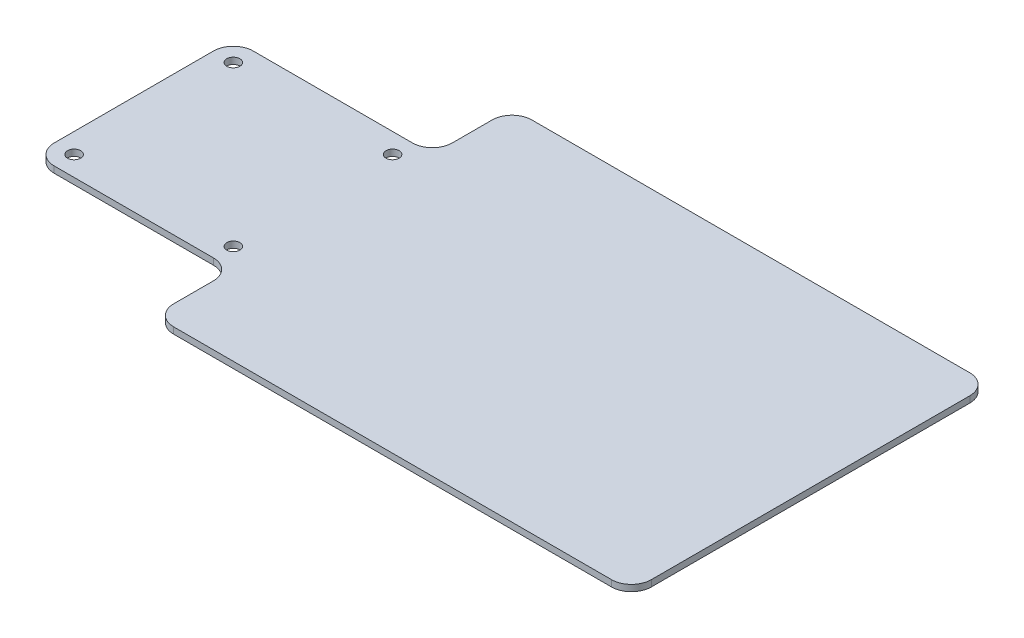
ISO-10303-21;
HEADER;
FILE_DESCRIPTION(('STEP AP214'),'2;1');
FILE_NAME('part.step','',(''),(''),'','','');
FILE_SCHEMA(('AUTOMOTIVE_DESIGN { 1 0 10303 214 1 1 1 1 }'));
ENDSEC;
DATA;
#1=APPLICATION_CONTEXT('core data for automotive mechanical design processes');
#2=APPLICATION_PROTOCOL_DEFINITION('international standard','automotive_design',2000,#1);
#3=PRODUCT_CONTEXT('',#1,'mechanical');
#4=PRODUCT('Part','Part','',(#3));
#5=PRODUCT_RELATED_PRODUCT_CATEGORY('part','',(#4));
#6=PRODUCT_DEFINITION_FORMATION('','',#4);
#7=PRODUCT_DEFINITION_CONTEXT('part definition',#1,'design');
#8=PRODUCT_DEFINITION('design','',#6,#7);
#9=PRODUCT_DEFINITION_SHAPE('','',#8);
#10=(LENGTH_UNIT() NAMED_UNIT(*) SI_UNIT(.MILLI.,.METRE.));
#11=(NAMED_UNIT(*) PLANE_ANGLE_UNIT() SI_UNIT($,.RADIAN.));
#12=(NAMED_UNIT(*) SI_UNIT($,.STERADIAN.) SOLID_ANGLE_UNIT());
#13=UNCERTAINTY_MEASURE_WITH_UNIT(LENGTH_MEASURE(1.E-05),#10,'distance_accuracy_value','');
#14=(GEOMETRIC_REPRESENTATION_CONTEXT(3) GLOBAL_UNCERTAINTY_ASSIGNED_CONTEXT((#13)) GLOBAL_UNIT_ASSIGNED_CONTEXT((#10,
#11,#12)) REPRESENTATION_CONTEXT('',''));
#15=CARTESIAN_POINT('',(0.,0.,0.));
#16=DIRECTION('',(0.,0.,1.));
#17=DIRECTION('',(1.,0.,0.));
#18=AXIS2_PLACEMENT_3D('',#15,#16,#17);
#19=CARTESIAN_POINT('',(-25.,1.6,25.));
#20=DIRECTION('',(0.,0.,-1.));
#21=DIRECTION('',(-1.,0.,0.));
#22=AXIS2_PLACEMENT_3D('',#19,#20,#21);
#23=PLANE('',#22);
#24=DIRECTION('',(1.,0.,0.));
#25=VECTOR('',#24,1.);
#26=CARTESIAN_POINT('',(-25.,1.6,25.));
#27=LINE('',#26,#25);
#28=CARTESIAN_POINT('',(-20.,1.6,25.));
#29=VERTEX_POINT('',#28);
#30=CARTESIAN_POINT('',(20.,1.6,25.));
#31=VERTEX_POINT('',#30);
#32=EDGE_CURVE('E164',#29,#31,#27,.T.);
#33=ORIENTED_EDGE('',*,*,#32,.F.);
#34=DIRECTION('',(0.,-1.,0.));
#35=VECTOR('',#34,1.);
#36=CARTESIAN_POINT('',(-20.,1.6,25.));
#37=LINE('',#36,#35);
#38=CARTESIAN_POINT('',(-20.,0.,25.));
#39=VERTEX_POINT('',#38);
#40=EDGE_CURVE('E149',#29,#39,#37,.T.);
#41=ORIENTED_EDGE('',*,*,#40,.T.);
#42=DIRECTION('',(1.,0.,0.));
#43=VECTOR('',#42,1.);
#44=CARTESIAN_POINT('',(-25.,0.,25.));
#45=LINE('',#44,#43);
#46=CARTESIAN_POINT('',(20.,0.,25.));
#47=VERTEX_POINT('',#46);
#48=EDGE_CURVE('E161',#39,#47,#45,.T.);
#49=ORIENTED_EDGE('',*,*,#48,.T.);
#50=DIRECTION('',(0.,-1.,0.));
#51=VECTOR('',#50,1.);
#52=CARTESIAN_POINT('',(20.,1.6,25.));
#53=LINE('',#52,#51);
#54=EDGE_CURVE('E166',#47,#31,#53,.F.);
#55=ORIENTED_EDGE('',*,*,#54,.T.);
#56=EDGE_LOOP('',(#33,#41,#49,#55));
#57=FACE_BOUND('',#56,.T.);
#58=ADVANCED_FACE('F32',(#57),#23,.F.);
#59=CARTESIAN_POINT('',(25.,1.6,25.));
#60=DIRECTION('',(1.,0.,0.));
#61=DIRECTION('',(0.,0.,-1.));
#62=AXIS2_PLACEMENT_3D('',#59,#60,#61);
#63=PLANE('',#62);
#64=DIRECTION('',(0.,0.,1.));
#65=VECTOR('',#64,1.);
#66=CARTESIAN_POINT('',(25.,1.6,25.));
#67=LINE('',#66,#65);
#68=CARTESIAN_POINT('',(25.,1.6,30.));
#69=VERTEX_POINT('',#68);
#70=CARTESIAN_POINT('',(25.,1.6,40.));
#71=VERTEX_POINT('',#70);
#72=EDGE_CURVE('E280',#69,#71,#67,.T.);
#73=ORIENTED_EDGE('',*,*,#72,.F.);
#74=DIRECTION('',(0.,-1.,0.));
#75=VECTOR('',#74,1.);
#76=CARTESIAN_POINT('',(25.,0.,30.));
#77=LINE('',#76,#75);
#78=CARTESIAN_POINT('',(25.,0.,30.));
#79=VERTEX_POINT('',#78);
#80=EDGE_CURVE('E225',#69,#79,#77,.T.);
#81=ORIENTED_EDGE('',*,*,#80,.T.);
#82=DIRECTION('',(0.,0.,1.));
#83=VECTOR('',#82,1.);
#84=CARTESIAN_POINT('',(25.,0.,25.));
#85=LINE('',#84,#83);
#86=CARTESIAN_POINT('',(25.,0.,40.));
#87=VERTEX_POINT('',#86);
#88=EDGE_CURVE('E171',#79,#87,#85,.T.);
#89=ORIENTED_EDGE('',*,*,#88,.T.);
#90=DIRECTION('',(0.,-1.,0.));
#91=VECTOR('',#90,1.);
#92=CARTESIAN_POINT('',(25.,1.6,40.));
#93=LINE('',#92,#91);
#94=EDGE_CURVE('E223',#87,#71,#93,.F.);
#95=ORIENTED_EDGE('',*,*,#94,.T.);
#96=EDGE_LOOP('',(#73,#81,#89,#95));
#97=FACE_BOUND('',#96,.T.);
#98=ADVANCED_FACE('F338',(#97),#63,.F.);
#99=CARTESIAN_POINT('',(25.,1.6,45.));
#100=DIRECTION('',(0.,0.,-1.));
#101=DIRECTION('',(-1.,0.,0.));
#102=AXIS2_PLACEMENT_3D('',#99,#100,#101);
#103=PLANE('',#102);
#104=DIRECTION('',(1.,0.,0.));
#105=VECTOR('',#104,1.);
#106=CARTESIAN_POINT('',(25.,1.6,45.));
#107=LINE('',#106,#105);
#108=CARTESIAN_POINT('',(30.,1.6,45.));
#109=VERTEX_POINT('',#108);
#110=CARTESIAN_POINT('',(140.,1.6,45.));
#111=VERTEX_POINT('',#110);
#112=EDGE_CURVE('E277',#109,#111,#107,.T.);
#113=ORIENTED_EDGE('',*,*,#112,.F.);
#114=DIRECTION('',(0.,-1.,0.));
#115=VECTOR('',#114,1.);
#116=CARTESIAN_POINT('',(30.,1.6,45.));
#117=LINE('',#116,#115);
#118=CARTESIAN_POINT('',(30.,0.,45.));
#119=VERTEX_POINT('',#118);
#120=EDGE_CURVE('E230',#109,#119,#117,.T.);
#121=ORIENTED_EDGE('',*,*,#120,.T.);
#122=DIRECTION('',(1.,0.,0.));
#123=VECTOR('',#122,1.);
#124=CARTESIAN_POINT('',(25.,0.,45.));
#125=LINE('',#124,#123);
#126=CARTESIAN_POINT('',(140.,0.,45.));
#127=VERTEX_POINT('',#126);
#128=EDGE_CURVE('E175',#119,#127,#125,.T.);
#129=ORIENTED_EDGE('',*,*,#128,.T.);
#130=DIRECTION('',(0.,-1.,0.));
#131=VECTOR('',#130,1.);
#132=CARTESIAN_POINT('',(140.,1.6,45.));
#133=LINE('',#132,#131);
#134=EDGE_CURVE('E228',#127,#111,#133,.F.);
#135=ORIENTED_EDGE('',*,*,#134,.T.);
#136=EDGE_LOOP('',(#113,#121,#129,#135));
#137=FACE_BOUND('',#136,.T.);
#138=ADVANCED_FACE('F343',(#137),#103,.F.);
#139=CARTESIAN_POINT('',(145.,1.6,-45.));
#140=DIRECTION('',(-1.,0.,0.));
#141=DIRECTION('',(0.,0.,1.));
#142=AXIS2_PLACEMENT_3D('',#139,#140,#141);
#143=PLANE('',#142);
#144=DIRECTION('',(0.,0.,-1.));
#145=VECTOR('',#144,1.);
#146=CARTESIAN_POINT('',(145.,0.,-45.));
#147=LINE('',#146,#145);
#148=CARTESIAN_POINT('',(145.,0.,40.));
#149=VERTEX_POINT('',#148);
#150=CARTESIAN_POINT('',(145.,0.,-40.));
#151=VERTEX_POINT('',#150);
#152=EDGE_CURVE('E186',#149,#151,#147,.T.);
#153=ORIENTED_EDGE('',*,*,#152,.T.);
#154=DIRECTION('',(0.,-1.,0.));
#155=VECTOR('',#154,1.);
#156=CARTESIAN_POINT('',(145.,1.6,-40.));
#157=LINE('',#156,#155);
#158=CARTESIAN_POINT('',(145.,1.6,-40.));
#159=VERTEX_POINT('',#158);
#160=EDGE_CURVE('E250',#151,#159,#157,.F.);
#161=ORIENTED_EDGE('',*,*,#160,.T.);
#162=DIRECTION('',(0.,0.,-1.));
#163=VECTOR('',#162,1.);
#164=CARTESIAN_POINT('',(145.,1.6,-45.));
#165=LINE('',#164,#163);
#166=CARTESIAN_POINT('',(145.,1.6,40.));
#167=VERTEX_POINT('',#166);
#168=EDGE_CURVE('E274',#167,#159,#165,.T.);
#169=ORIENTED_EDGE('',*,*,#168,.F.);
#170=DIRECTION('',(0.,-1.,0.));
#171=VECTOR('',#170,1.);
#172=CARTESIAN_POINT('',(145.,1.6,40.));
#173=LINE('',#172,#171);
#174=EDGE_CURVE('E247',#167,#149,#173,.T.);
#175=ORIENTED_EDGE('',*,*,#174,.T.);
#176=EDGE_LOOP('',(#153,#161,#169,#175));
#177=FACE_BOUND('',#176,.T.);
#178=ADVANCED_FACE('F373',(#177),#143,.F.);
#179=CARTESIAN_POINT('',(25.,1.6,-45.));
#180=DIRECTION('',(0.,0.,1.));
#181=DIRECTION('',(1.,0.,0.));
#182=AXIS2_PLACEMENT_3D('',#179,#180,#181);
#183=PLANE('',#182);
#184=DIRECTION('',(-1.,0.,0.));
#185=VECTOR('',#184,1.);
#186=CARTESIAN_POINT('',(25.,0.,-45.));
#187=LINE('',#186,#185);
#188=CARTESIAN_POINT('',(140.,0.,-45.));
#189=VERTEX_POINT('',#188);
#190=CARTESIAN_POINT('',(30.,0.,-45.));
#191=VERTEX_POINT('',#190);
#192=EDGE_CURVE('E189',#189,#191,#187,.T.);
#193=ORIENTED_EDGE('',*,*,#192,.T.);
#194=DIRECTION('',(0.,-1.,0.));
#195=VECTOR('',#194,1.);
#196=CARTESIAN_POINT('',(30.,1.6,-45.));
#197=LINE('',#196,#195);
#198=CARTESIAN_POINT('',(30.,1.6,-45.));
#199=VERTEX_POINT('',#198);
#200=EDGE_CURVE('E241',#191,#199,#197,.F.);
#201=ORIENTED_EDGE('',*,*,#200,.T.);
#202=DIRECTION('',(-1.,0.,0.));
#203=VECTOR('',#202,1.);
#204=CARTESIAN_POINT('',(25.,1.6,-45.));
#205=LINE('',#204,#203);
#206=CARTESIAN_POINT('',(140.,1.6,-45.));
#207=VERTEX_POINT('',#206);
#208=EDGE_CURVE('E269',#207,#199,#205,.T.);
#209=ORIENTED_EDGE('',*,*,#208,.F.);
#210=DIRECTION('',(0.,-1.,0.));
#211=VECTOR('',#210,1.);
#212=CARTESIAN_POINT('',(140.,1.6,-45.));
#213=LINE('',#212,#211);
#214=EDGE_CURVE('E238',#207,#189,#213,.T.);
#215=ORIENTED_EDGE('',*,*,#214,.T.);
#216=EDGE_LOOP('',(#193,#201,#209,#215));
#217=FACE_BOUND('',#216,.T.);
#218=ADVANCED_FACE('F368',(#217),#183,.F.);
#219=CARTESIAN_POINT('',(25.,1.6,-25.));
#220=DIRECTION('',(1.,0.,0.));
#221=DIRECTION('',(0.,0.,-1.));
#222=AXIS2_PLACEMENT_3D('',#219,#220,#221);
#223=PLANE('',#222);
#224=DIRECTION('',(0.,0.,1.));
#225=VECTOR('',#224,1.);
#226=CARTESIAN_POINT('',(25.,1.6,-25.));
#227=LINE('',#226,#225);
#228=CARTESIAN_POINT('',(25.,1.6,-40.));
#229=VERTEX_POINT('',#228);
#230=CARTESIAN_POINT('',(25.,1.6,-30.));
#231=VERTEX_POINT('',#230);
#232=EDGE_CURVE('E267',#229,#231,#227,.T.);
#233=ORIENTED_EDGE('',*,*,#232,.F.);
#234=DIRECTION('',(0.,-1.,0.));
#235=VECTOR('',#234,1.);
#236=CARTESIAN_POINT('',(25.,1.6,-40.));
#237=LINE('',#236,#235);
#238=CARTESIAN_POINT('',(25.,0.,-40.));
#239=VERTEX_POINT('',#238);
#240=EDGE_CURVE('E235',#229,#239,#237,.T.);
#241=ORIENTED_EDGE('',*,*,#240,.T.);
#242=DIRECTION('',(0.,0.,1.));
#243=VECTOR('',#242,1.);
#244=CARTESIAN_POINT('',(25.,0.,-25.));
#245=LINE('',#244,#243);
#246=CARTESIAN_POINT('',(25.,0.,-30.));
#247=VERTEX_POINT('',#246);
#248=EDGE_CURVE('E192',#239,#247,#245,.T.);
#249=ORIENTED_EDGE('',*,*,#248,.T.);
#250=DIRECTION('',(0.,-1.,0.));
#251=VECTOR('',#250,1.);
#252=CARTESIAN_POINT('',(25.,1.6,-30.));
#253=LINE('',#252,#251);
#254=EDGE_CURVE('E233',#247,#231,#253,.F.);
#255=ORIENTED_EDGE('',*,*,#254,.T.);
#256=EDGE_LOOP('',(#233,#241,#249,#255));
#257=FACE_BOUND('',#256,.T.);
#258=ADVANCED_FACE('F261',(#257),#223,.F.);
#259=CARTESIAN_POINT('',(-25.,1.6,-25.));
#260=DIRECTION('',(0.,0.,1.));
#261=DIRECTION('',(1.,0.,0.));
#262=AXIS2_PLACEMENT_3D('',#259,#260,#261);
#263=PLANE('',#262);
#264=DIRECTION('',(-1.,0.,0.));
#265=VECTOR('',#264,1.);
#266=CARTESIAN_POINT('',(-25.,1.6,-25.));
#267=LINE('',#266,#265);
#268=CARTESIAN_POINT('',(20.,1.6,-25.));
#269=VERTEX_POINT('',#268);
#270=CARTESIAN_POINT('',(-20.,1.6,-25.));
#271=VERTEX_POINT('',#270);
#272=EDGE_CURVE('E265',#269,#271,#267,.T.);
#273=ORIENTED_EDGE('',*,*,#272,.F.);
#274=DIRECTION('',(0.,-1.,0.));
#275=VECTOR('',#274,1.);
#276=CARTESIAN_POINT('',(20.,0.,-25.));
#277=LINE('',#276,#275);
#278=CARTESIAN_POINT('',(20.,0.,-25.));
#279=VERTEX_POINT('',#278);
#280=EDGE_CURVE('E244',#269,#279,#277,.T.);
#281=ORIENTED_EDGE('',*,*,#280,.T.);
#282=DIRECTION('',(-1.,0.,0.));
#283=VECTOR('',#282,1.);
#284=CARTESIAN_POINT('',(-25.,0.,-25.));
#285=LINE('',#284,#283);
#286=CARTESIAN_POINT('',(-20.,0.,-25.));
#287=VERTEX_POINT('',#286);
#288=EDGE_CURVE('E195',#279,#287,#285,.T.);
#289=ORIENTED_EDGE('',*,*,#288,.T.);
#290=DIRECTION('',(0.,-1.,0.));
#291=VECTOR('',#290,1.);
#292=CARTESIAN_POINT('',(-20.,1.6,-25.));
#293=LINE('',#292,#291);
#294=EDGE_CURVE('E47',#287,#271,#293,.F.);
#295=ORIENTED_EDGE('',*,*,#294,.T.);
#296=EDGE_LOOP('',(#273,#281,#289,#295));
#297=FACE_BOUND('',#296,.T.);
#298=ADVANCED_FACE('F264',(#297),#263,.F.);
#299=CARTESIAN_POINT('',(-25.,1.6,-25.));
#300=DIRECTION('',(1.,0.,0.));
#301=DIRECTION('',(0.,0.,-1.));
#302=AXIS2_PLACEMENT_3D('',#299,#300,#301);
#303=PLANE('',#302);
#304=DIRECTION('',(0.,0.,1.));
#305=VECTOR('',#304,1.);
#306=CARTESIAN_POINT('',(-25.,0.,-25.));
#307=LINE('',#306,#305);
#308=CARTESIAN_POINT('',(-25.,0.,-20.));
#309=VERTEX_POINT('',#308);
#310=CARTESIAN_POINT('',(-25.,0.,20.));
#311=VERTEX_POINT('',#310);
#312=EDGE_CURVE('E197',#309,#311,#307,.T.);
#313=ORIENTED_EDGE('',*,*,#312,.T.);
#314=DIRECTION('',(0.,-1.,0.));
#315=VECTOR('',#314,1.);
#316=CARTESIAN_POINT('',(-25.,1.6,20.));
#317=LINE('',#316,#315);
#318=CARTESIAN_POINT('',(-25.,1.6,20.));
#319=VERTEX_POINT('',#318);
#320=EDGE_CURVE('E150',#311,#319,#317,.F.);
#321=ORIENTED_EDGE('',*,*,#320,.T.);
#322=DIRECTION('',(0.,0.,1.));
#323=VECTOR('',#322,1.);
#324=CARTESIAN_POINT('',(-25.,1.6,-25.));
#325=LINE('',#324,#323);
#326=CARTESIAN_POINT('',(-25.,1.6,-20.));
#327=VERTEX_POINT('',#326);
#328=EDGE_CURVE('E181',#327,#319,#325,.T.);
#329=ORIENTED_EDGE('',*,*,#328,.F.);
#330=DIRECTION('',(0.,-1.,0.));
#331=VECTOR('',#330,1.);
#332=CARTESIAN_POINT('',(-25.,1.6,-20.));
#333=LINE('',#332,#331);
#334=EDGE_CURVE('E155',#327,#309,#333,.T.);
#335=ORIENTED_EDGE('',*,*,#334,.T.);
#336=EDGE_LOOP('',(#313,#321,#329,#335));
#337=FACE_BOUND('',#336,.T.);
#338=ADVANCED_FACE('F318',(#337),#303,.F.);
#339=CARTESIAN_POINT('',(0.,1.6,0.));
#340=DIRECTION('',(0.,-1.,0.));
#341=DIRECTION('',(0.,0.,-1.));
#342=AXIS2_PLACEMENT_3D('',#339,#340,#341);
#343=PLANE('',#342);
#344=CARTESIAN_POINT('',(-20.,1.6,20.));
#345=DIRECTION('',(0.,1.,0.));
#346=DIRECTION('',(0.,0.,1.));
#347=AXIS2_PLACEMENT_3D('',#344,#345,#346);
#348=CIRCLE('',#347,1.65);
#349=CARTESIAN_POINT('',(-20.,1.6,21.65));
#350=VERTEX_POINT('',#349);
#351=EDGE_CURVE('E287',#350,#350,#348,.T.);
#352=ORIENTED_EDGE('',*,*,#351,.F.);
#353=EDGE_LOOP('',(#352));
#354=FACE_BOUND('',#353,.T.);
#355=CARTESIAN_POINT('',(20.,1.6,20.));
#356=DIRECTION('',(0.,1.,0.));
#357=DIRECTION('',(0.,0.,1.));
#358=AXIS2_PLACEMENT_3D('',#355,#356,#357);
#359=CIRCLE('',#358,1.65);
#360=CARTESIAN_POINT('',(20.,1.6,21.65));
#361=VERTEX_POINT('',#360);
#362=EDGE_CURVE('E293',#361,#361,#359,.T.);
#363=ORIENTED_EDGE('',*,*,#362,.F.);
#364=EDGE_LOOP('',(#363));
#365=FACE_BOUND('',#364,.T.);
#366=CARTESIAN_POINT('',(20.,1.6,-20.));
#367=DIRECTION('',(0.,1.,0.));
#368=DIRECTION('',(0.,0.,1.));
#369=AXIS2_PLACEMENT_3D('',#366,#367,#368);
#370=CIRCLE('',#369,1.65);
#371=CARTESIAN_POINT('',(20.,1.6,-18.35));
#372=VERTEX_POINT('',#371);
#373=EDGE_CURVE('E299',#372,#372,#370,.T.);
#374=ORIENTED_EDGE('',*,*,#373,.F.);
#375=EDGE_LOOP('',(#374));
#376=FACE_BOUND('',#375,.T.);
#377=CARTESIAN_POINT('',(-20.,1.6,-20.));
#378=DIRECTION('',(0.,1.,0.));
#379=DIRECTION('',(0.,0.,1.));
#380=AXIS2_PLACEMENT_3D('',#377,#378,#379);
#381=CIRCLE('',#380,1.65);
#382=CARTESIAN_POINT('',(-20.,1.6,-18.35));
#383=VERTEX_POINT('',#382);
#384=EDGE_CURVE('E178',#383,#383,#381,.T.);
#385=ORIENTED_EDGE('',*,*,#384,.F.);
#386=EDGE_LOOP('',(#385));
#387=FACE_BOUND('',#386,.T.);
#388=ORIENTED_EDGE('',*,*,#328,.T.);
#389=CARTESIAN_POINT('',(-20.,1.6,20.));
#390=DIRECTION('',(0.,-1.,0.));
#391=DIRECTION('',(0.,0.,-1.));
#392=AXIS2_PLACEMENT_3D('',#389,#390,#391);
#393=CIRCLE('',#392,5.);
#394=EDGE_CURVE('E221',#319,#29,#393,.F.);
#395=ORIENTED_EDGE('',*,*,#394,.T.);
#396=ORIENTED_EDGE('',*,*,#32,.T.);
#397=CARTESIAN_POINT('',(20.,1.6,30.));
#398=DIRECTION('',(0.,-1.,0.));
#399=DIRECTION('',(0.,0.,-1.));
#400=AXIS2_PLACEMENT_3D('',#397,#398,#399);
#401=CIRCLE('',#400,5.);
#402=EDGE_CURVE('E253',#31,#69,#401,.T.);
#403=ORIENTED_EDGE('',*,*,#402,.T.);
#404=ORIENTED_EDGE('',*,*,#72,.T.);
#405=CARTESIAN_POINT('',(30.,1.6,40.));
#406=DIRECTION('',(0.,-1.,0.));
#407=DIRECTION('',(0.,0.,-1.));
#408=AXIS2_PLACEMENT_3D('',#405,#406,#407);
#409=CIRCLE('',#408,5.);
#410=EDGE_CURVE('E219',#71,#109,#409,.F.);
#411=ORIENTED_EDGE('',*,*,#410,.T.);
#412=ORIENTED_EDGE('',*,*,#112,.T.);
#413=CARTESIAN_POINT('',(140.,1.6,40.));
#414=DIRECTION('',(0.,-1.,0.));
#415=DIRECTION('',(0.,0.,-1.));
#416=AXIS2_PLACEMENT_3D('',#413,#414,#415);
#417=CIRCLE('',#416,5.);
#418=EDGE_CURVE('E211',#111,#167,#417,.F.);
#419=ORIENTED_EDGE('',*,*,#418,.T.);
#420=ORIENTED_EDGE('',*,*,#168,.T.);
#421=CARTESIAN_POINT('',(140.,1.6,-40.));
#422=DIRECTION('',(0.,-1.,0.));
#423=DIRECTION('',(0.,0.,-1.));
#424=AXIS2_PLACEMENT_3D('',#421,#422,#423);
#425=CIRCLE('',#424,5.);
#426=EDGE_CURVE('E213',#159,#207,#425,.F.);
#427=ORIENTED_EDGE('',*,*,#426,.T.);
#428=ORIENTED_EDGE('',*,*,#208,.T.);
#429=CARTESIAN_POINT('',(30.,1.6,-40.));
#430=DIRECTION('',(0.,-1.,0.));
#431=DIRECTION('',(0.,0.,-1.));
#432=AXIS2_PLACEMENT_3D('',#429,#430,#431);
#433=CIRCLE('',#432,5.);
#434=EDGE_CURVE('E217',#199,#229,#433,.F.);
#435=ORIENTED_EDGE('',*,*,#434,.T.);
#436=ORIENTED_EDGE('',*,*,#232,.T.);
#437=CARTESIAN_POINT('',(20.,1.6,-30.));
#438=DIRECTION('',(0.,-1.,0.));
#439=DIRECTION('',(0.,0.,-1.));
#440=AXIS2_PLACEMENT_3D('',#437,#438,#439);
#441=CIRCLE('',#440,5.);
#442=EDGE_CURVE('E11',#231,#269,#441,.T.);
#443=ORIENTED_EDGE('',*,*,#442,.T.);
#444=ORIENTED_EDGE('',*,*,#272,.T.);
#445=CARTESIAN_POINT('',(-20.,1.6,-20.));
#446=DIRECTION('',(0.,-1.,0.));
#447=DIRECTION('',(0.,0.,-1.));
#448=AXIS2_PLACEMENT_3D('',#445,#446,#447);
#449=CIRCLE('',#448,5.);
#450=EDGE_CURVE('E215',#271,#327,#449,.F.);
#451=ORIENTED_EDGE('',*,*,#450,.T.);
#452=EDGE_LOOP('',(#388,#395,#396,#403,#404,#411,#412,#419,#420,#427,#428,#435,#436,#443,#444,#451));
#453=FACE_BOUND('',#452,.T.);
#454=ADVANCED_FACE('F315',(#354,#365,#376,#387,#453),#343,.F.);
#455=CARTESIAN_POINT('',(0.,0.,0.));
#456=DIRECTION('',(0.,-1.,0.));
#457=DIRECTION('',(0.,0.,-1.));
#458=AXIS2_PLACEMENT_3D('',#455,#456,#457);
#459=PLANE('',#458);
#460=CARTESIAN_POINT('',(-20.,0.,20.));
#461=DIRECTION('',(0.,1.,0.));
#462=DIRECTION('',(0.,0.,1.));
#463=AXIS2_PLACEMENT_3D('',#460,#461,#462);
#464=CIRCLE('',#463,1.65);
#465=CARTESIAN_POINT('',(-20.,0.,21.65));
#466=VERTEX_POINT('',#465);
#467=EDGE_CURVE('E290',#466,#466,#464,.T.);
#468=ORIENTED_EDGE('',*,*,#467,.T.);
#469=EDGE_LOOP('',(#468));
#470=FACE_BOUND('',#469,.T.);
#471=CARTESIAN_POINT('',(20.,0.,20.));
#472=DIRECTION('',(0.,1.,0.));
#473=DIRECTION('',(0.,0.,1.));
#474=AXIS2_PLACEMENT_3D('',#471,#472,#473);
#475=CIRCLE('',#474,1.65);
#476=CARTESIAN_POINT('',(20.,0.,21.65));
#477=VERTEX_POINT('',#476);
#478=EDGE_CURVE('E296',#477,#477,#475,.T.);
#479=ORIENTED_EDGE('',*,*,#478,.T.);
#480=EDGE_LOOP('',(#479));
#481=FACE_BOUND('',#480,.T.);
#482=CARTESIAN_POINT('',(20.,0.,-20.));
#483=DIRECTION('',(0.,1.,0.));
#484=DIRECTION('',(0.,0.,1.));
#485=AXIS2_PLACEMENT_3D('',#482,#483,#484);
#486=CIRCLE('',#485,1.65);
#487=CARTESIAN_POINT('',(20.,0.,-18.35));
#488=VERTEX_POINT('',#487);
#489=EDGE_CURVE('E285',#488,#488,#486,.T.);
#490=ORIENTED_EDGE('',*,*,#489,.T.);
#491=EDGE_LOOP('',(#490));
#492=FACE_BOUND('',#491,.T.);
#493=CARTESIAN_POINT('',(-20.,0.,-20.));
#494=DIRECTION('',(0.,1.,0.));
#495=DIRECTION('',(0.,0.,1.));
#496=AXIS2_PLACEMENT_3D('',#493,#494,#495);
#497=CIRCLE('',#496,1.65);
#498=CARTESIAN_POINT('',(-20.,0.,-18.35));
#499=VERTEX_POINT('',#498);
#500=EDGE_CURVE('E172',#499,#499,#497,.T.);
#501=ORIENTED_EDGE('',*,*,#500,.T.);
#502=EDGE_LOOP('',(#501));
#503=FACE_BOUND('',#502,.T.);
#504=ORIENTED_EDGE('',*,*,#48,.F.);
#505=CARTESIAN_POINT('',(-20.,0.,20.));
#506=DIRECTION('',(0.,-1.,0.));
#507=DIRECTION('',(0.,0.,-1.));
#508=AXIS2_PLACEMENT_3D('',#505,#506,#507);
#509=CIRCLE('',#508,5.);
#510=EDGE_CURVE('E145',#39,#311,#509,.T.);
#511=ORIENTED_EDGE('',*,*,#510,.T.);
#512=ORIENTED_EDGE('',*,*,#312,.F.);
#513=CARTESIAN_POINT('',(-20.,0.,-20.));
#514=DIRECTION('',(0.,-1.,0.));
#515=DIRECTION('',(0.,0.,-1.));
#516=AXIS2_PLACEMENT_3D('',#513,#514,#515);
#517=CIRCLE('',#516,5.);
#518=EDGE_CURVE('E203',#309,#287,#517,.T.);
#519=ORIENTED_EDGE('',*,*,#518,.T.);
#520=ORIENTED_EDGE('',*,*,#288,.F.);
#521=CARTESIAN_POINT('',(20.,0.,-30.));
#522=DIRECTION('',(0.,-1.,0.));
#523=DIRECTION('',(0.,0.,-1.));
#524=AXIS2_PLACEMENT_3D('',#521,#522,#523);
#525=CIRCLE('',#524,5.);
#526=EDGE_CURVE('E40',#279,#247,#525,.F.);
#527=ORIENTED_EDGE('',*,*,#526,.T.);
#528=ORIENTED_EDGE('',*,*,#248,.F.);
#529=CARTESIAN_POINT('',(30.,0.,-40.));
#530=DIRECTION('',(0.,-1.,0.));
#531=DIRECTION('',(0.,0.,-1.));
#532=AXIS2_PLACEMENT_3D('',#529,#530,#531);
#533=CIRCLE('',#532,5.);
#534=EDGE_CURVE('E205',#239,#191,#533,.T.);
#535=ORIENTED_EDGE('',*,*,#534,.T.);
#536=ORIENTED_EDGE('',*,*,#192,.F.);
#537=CARTESIAN_POINT('',(140.,0.,-40.));
#538=DIRECTION('',(0.,-1.,0.));
#539=DIRECTION('',(0.,0.,-1.));
#540=AXIS2_PLACEMENT_3D('',#537,#538,#539);
#541=CIRCLE('',#540,5.);
#542=EDGE_CURVE('E201',#189,#151,#541,.T.);
#543=ORIENTED_EDGE('',*,*,#542,.T.);
#544=ORIENTED_EDGE('',*,*,#152,.F.);
#545=CARTESIAN_POINT('',(140.,0.,40.));
#546=DIRECTION('',(0.,-1.,0.));
#547=DIRECTION('',(0.,0.,-1.));
#548=AXIS2_PLACEMENT_3D('',#545,#546,#547);
#549=CIRCLE('',#548,5.);
#550=EDGE_CURVE('E165',#149,#127,#549,.T.);
#551=ORIENTED_EDGE('',*,*,#550,.T.);
#552=ORIENTED_EDGE('',*,*,#128,.F.);
#553=CARTESIAN_POINT('',(30.,0.,40.));
#554=DIRECTION('',(0.,-1.,0.));
#555=DIRECTION('',(0.,0.,-1.));
#556=AXIS2_PLACEMENT_3D('',#553,#554,#555);
#557=CIRCLE('',#556,5.);
#558=EDGE_CURVE('E156',#119,#87,#557,.T.);
#559=ORIENTED_EDGE('',*,*,#558,.T.);
#560=ORIENTED_EDGE('',*,*,#88,.F.);
#561=CARTESIAN_POINT('',(20.,0.,30.));
#562=DIRECTION('',(0.,-1.,0.));
#563=DIRECTION('',(0.,0.,-1.));
#564=AXIS2_PLACEMENT_3D('',#561,#562,#563);
#565=CIRCLE('',#564,5.);
#566=EDGE_CURVE('E170',#79,#47,#565,.F.);
#567=ORIENTED_EDGE('',*,*,#566,.T.);
#568=EDGE_LOOP('',(#504,#511,#512,#519,#520,#527,#528,#535,#536,#543,#544,#551,#552,#559,#560,#567));
#569=FACE_BOUND('',#568,.T.);
#570=ADVANCED_FACE('F168',(#470,#481,#492,#503,#569),#459,.T.);
#571=CARTESIAN_POINT('',(-20.,1.6,20.));
#572=DIRECTION('',(0.,-1.,0.));
#573=DIRECTION('',(0.,0.,-1.));
#574=AXIS2_PLACEMENT_3D('',#571,#572,#573);
#575=CYLINDRICAL_SURFACE('',#574,5.);
#576=ORIENTED_EDGE('',*,*,#394,.F.);
#577=ORIENTED_EDGE('',*,*,#320,.F.);
#578=ORIENTED_EDGE('',*,*,#510,.F.);
#579=ORIENTED_EDGE('',*,*,#40,.F.);
#580=EDGE_LOOP('',(#576,#577,#578,#579));
#581=FACE_BOUND('',#580,.T.);
#582=ADVANCED_FACE('F148',(#581),#575,.T.);
#583=CARTESIAN_POINT('',(20.,1.6,30.));
#584=DIRECTION('',(0.,1.,0.));
#585=DIRECTION('',(0.,0.,1.));
#586=AXIS2_PLACEMENT_3D('',#583,#584,#585);
#587=CYLINDRICAL_SURFACE('',#586,5.);
#588=ORIENTED_EDGE('',*,*,#402,.F.);
#589=ORIENTED_EDGE('',*,*,#54,.F.);
#590=ORIENTED_EDGE('',*,*,#566,.F.);
#591=ORIENTED_EDGE('',*,*,#80,.F.);
#592=EDGE_LOOP('',(#588,#589,#590,#591));
#593=FACE_BOUND('',#592,.T.);
#594=ADVANCED_FACE('F350',(#593),#587,.F.);
#595=CARTESIAN_POINT('',(30.,1.6,40.));
#596=DIRECTION('',(0.,-1.,0.));
#597=DIRECTION('',(0.,0.,-1.));
#598=AXIS2_PLACEMENT_3D('',#595,#596,#597);
#599=CYLINDRICAL_SURFACE('',#598,5.);
#600=ORIENTED_EDGE('',*,*,#410,.F.);
#601=ORIENTED_EDGE('',*,*,#94,.F.);
#602=ORIENTED_EDGE('',*,*,#558,.F.);
#603=ORIENTED_EDGE('',*,*,#120,.F.);
#604=EDGE_LOOP('',(#600,#601,#602,#603));
#605=FACE_BOUND('',#604,.T.);
#606=ADVANCED_FACE('F353',(#605),#599,.T.);
#607=CARTESIAN_POINT('',(30.,1.6,-40.));
#608=DIRECTION('',(0.,-1.,0.));
#609=DIRECTION('',(0.,0.,-1.));
#610=AXIS2_PLACEMENT_3D('',#607,#608,#609);
#611=CYLINDRICAL_SURFACE('',#610,5.);
#612=ORIENTED_EDGE('',*,*,#434,.F.);
#613=ORIENTED_EDGE('',*,*,#200,.F.);
#614=ORIENTED_EDGE('',*,*,#534,.F.);
#615=ORIENTED_EDGE('',*,*,#240,.F.);
#616=EDGE_LOOP('',(#612,#613,#614,#615));
#617=FACE_BOUND('',#616,.T.);
#618=ADVANCED_FACE('F335',(#617),#611,.T.);
#619=CARTESIAN_POINT('',(20.,1.6,-30.));
#620=DIRECTION('',(0.,1.,0.));
#621=DIRECTION('',(0.,0.,1.));
#622=AXIS2_PLACEMENT_3D('',#619,#620,#621);
#623=CYLINDRICAL_SURFACE('',#622,5.);
#624=ORIENTED_EDGE('',*,*,#442,.F.);
#625=ORIENTED_EDGE('',*,*,#254,.F.);
#626=ORIENTED_EDGE('',*,*,#526,.F.);
#627=ORIENTED_EDGE('',*,*,#280,.F.);
#628=EDGE_LOOP('',(#624,#625,#626,#627));
#629=FACE_BOUND('',#628,.T.);
#630=ADVANCED_FACE('F263',(#629),#623,.F.);
#631=CARTESIAN_POINT('',(-20.,1.6,-20.));
#632=DIRECTION('',(0.,-1.,0.));
#633=DIRECTION('',(0.,0.,-1.));
#634=AXIS2_PLACEMENT_3D('',#631,#632,#633);
#635=CYLINDRICAL_SURFACE('',#634,5.);
#636=ORIENTED_EDGE('',*,*,#450,.F.);
#637=ORIENTED_EDGE('',*,*,#294,.F.);
#638=ORIENTED_EDGE('',*,*,#518,.F.);
#639=ORIENTED_EDGE('',*,*,#334,.F.);
#640=EDGE_LOOP('',(#636,#637,#638,#639));
#641=FACE_BOUND('',#640,.T.);
#642=ADVANCED_FACE('F326',(#641),#635,.T.);
#643=CARTESIAN_POINT('',(140.,1.6,-40.));
#644=DIRECTION('',(0.,-1.,0.));
#645=DIRECTION('',(0.,0.,-1.));
#646=AXIS2_PLACEMENT_3D('',#643,#644,#645);
#647=CYLINDRICAL_SURFACE('',#646,5.);
#648=ORIENTED_EDGE('',*,*,#426,.F.);
#649=ORIENTED_EDGE('',*,*,#160,.F.);
#650=ORIENTED_EDGE('',*,*,#542,.F.);
#651=ORIENTED_EDGE('',*,*,#214,.F.);
#652=EDGE_LOOP('',(#648,#649,#650,#651));
#653=FACE_BOUND('',#652,.T.);
#654=ADVANCED_FACE('F328',(#653),#647,.T.);
#655=CARTESIAN_POINT('',(140.,1.6,40.));
#656=DIRECTION('',(0.,-1.,0.));
#657=DIRECTION('',(0.,0.,-1.));
#658=AXIS2_PLACEMENT_3D('',#655,#656,#657);
#659=CYLINDRICAL_SURFACE('',#658,5.);
#660=ORIENTED_EDGE('',*,*,#418,.F.);
#661=ORIENTED_EDGE('',*,*,#134,.F.);
#662=ORIENTED_EDGE('',*,*,#550,.F.);
#663=ORIENTED_EDGE('',*,*,#174,.F.);
#664=EDGE_LOOP('',(#660,#661,#662,#663));
#665=FACE_BOUND('',#664,.T.);
#666=ADVANCED_FACE('F34',(#665),#659,.T.);
#667=CARTESIAN_POINT('',(-20.,0.,-20.));
#668=DIRECTION('',(0.,1.,0.));
#669=DIRECTION('',(0.,0.,1.));
#670=AXIS2_PLACEMENT_3D('',#667,#668,#669);
#671=CYLINDRICAL_SURFACE('',#670,1.65);
#672=ORIENTED_EDGE('',*,*,#500,.F.);
#673=EDGE_LOOP('',(#672));
#674=FACE_BOUND('',#673,.T.);
#675=ORIENTED_EDGE('',*,*,#384,.T.);
#676=EDGE_LOOP('',(#675));
#677=FACE_BOUND('',#676,.T.);
#678=ADVANCED_FACE('F311',(#674,#677),#671,.F.);
#679=CARTESIAN_POINT('',(20.,0.,-20.));
#680=DIRECTION('',(0.,1.,0.));
#681=DIRECTION('',(0.,0.,1.));
#682=AXIS2_PLACEMENT_3D('',#679,#680,#681);
#683=CYLINDRICAL_SURFACE('',#682,1.65);
#684=ORIENTED_EDGE('',*,*,#489,.F.);
#685=EDGE_LOOP('',(#684));
#686=FACE_BOUND('',#685,.T.);
#687=ORIENTED_EDGE('',*,*,#373,.T.);
#688=EDGE_LOOP('',(#687));
#689=FACE_BOUND('',#688,.T.);
#690=ADVANCED_FACE('F307',(#686,#689),#683,.F.);
#691=CARTESIAN_POINT('',(20.,0.,20.));
#692=DIRECTION('',(0.,1.,0.));
#693=DIRECTION('',(0.,0.,1.));
#694=AXIS2_PLACEMENT_3D('',#691,#692,#693);
#695=CYLINDRICAL_SURFACE('',#694,1.65);
#696=ORIENTED_EDGE('',*,*,#478,.F.);
#697=EDGE_LOOP('',(#696));
#698=FACE_BOUND('',#697,.T.);
#699=ORIENTED_EDGE('',*,*,#362,.T.);
#700=EDGE_LOOP('',(#699));
#701=FACE_BOUND('',#700,.T.);
#702=ADVANCED_FACE('F310',(#698,#701),#695,.F.);
#703=CARTESIAN_POINT('',(-20.,0.,20.));
#704=DIRECTION('',(0.,1.,0.));
#705=DIRECTION('',(0.,0.,1.));
#706=AXIS2_PLACEMENT_3D('',#703,#704,#705);
#707=CYLINDRICAL_SURFACE('',#706,1.65);
#708=ORIENTED_EDGE('',*,*,#467,.F.);
#709=EDGE_LOOP('',(#708));
#710=FACE_BOUND('',#709,.T.);
#711=ORIENTED_EDGE('',*,*,#351,.T.);
#712=EDGE_LOOP('',(#711));
#713=FACE_BOUND('',#712,.T.);
#714=ADVANCED_FACE('F408',(#710,#713),#707,.F.);
#715=CLOSED_SHELL('',(#58,#98,#138,#178,#218,#258,#298,#338,#454,#570,#582,#594,#606,#618,#630,
#642,#654,#666,#678,#690,#702,#714));
#716=MANIFOLD_SOLID_BREP('B2',#715);
#717=ADVANCED_BREP_SHAPE_REPRESENTATION('',(#18,#716),#14);
#718=SHAPE_DEFINITION_REPRESENTATION(#9,#717);
ENDSEC;
END-ISO-10303-21;
